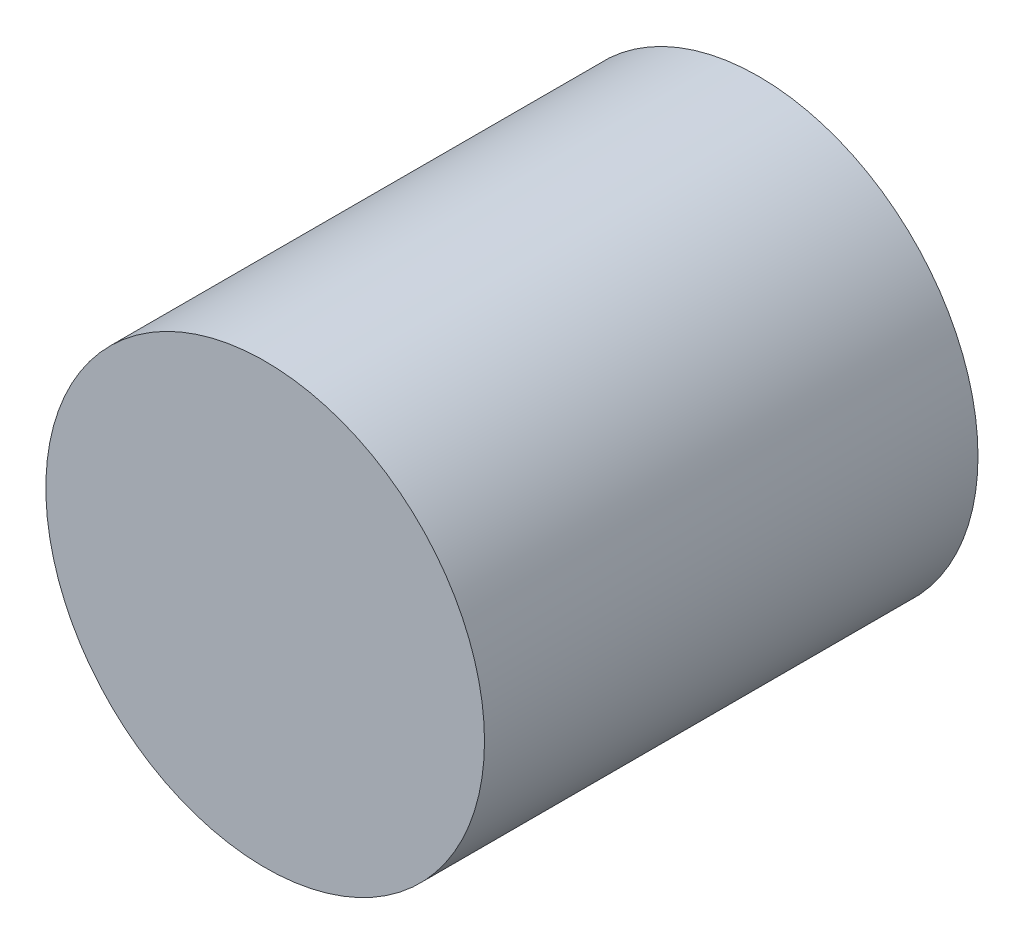
ISO-10303-21;
HEADER;
FILE_DESCRIPTION(('STEP AP214'),'2;1');
FILE_NAME('part.step','',(''),(''),'','','');
FILE_SCHEMA(('AUTOMOTIVE_DESIGN { 1 0 10303 214 1 1 1 1 }'));
ENDSEC;
DATA;
#1=APPLICATION_CONTEXT('core data for automotive mechanical design processes');
#2=APPLICATION_PROTOCOL_DEFINITION('international standard','automotive_design',2000,#1);
#3=PRODUCT_CONTEXT('',#1,'mechanical');
#4=PRODUCT('Part','Part','',(#3));
#5=PRODUCT_RELATED_PRODUCT_CATEGORY('part','',(#4));
#6=PRODUCT_DEFINITION_FORMATION('','',#4);
#7=PRODUCT_DEFINITION_CONTEXT('part definition',#1,'design');
#8=PRODUCT_DEFINITION('design','',#6,#7);
#9=PRODUCT_DEFINITION_SHAPE('','',#8);
#10=(LENGTH_UNIT() NAMED_UNIT(*) SI_UNIT(.MILLI.,.METRE.));
#11=(NAMED_UNIT(*) PLANE_ANGLE_UNIT() SI_UNIT($,.RADIAN.));
#12=(NAMED_UNIT(*) SI_UNIT($,.STERADIAN.) SOLID_ANGLE_UNIT());
#13=UNCERTAINTY_MEASURE_WITH_UNIT(LENGTH_MEASURE(1.E-05),#10,'distance_accuracy_value','');
#14=(GEOMETRIC_REPRESENTATION_CONTEXT(3) GLOBAL_UNCERTAINTY_ASSIGNED_CONTEXT((#13)) GLOBAL_UNIT_ASSIGNED_CONTEXT((#10,
#11,#12)) REPRESENTATION_CONTEXT('',''));
#15=CARTESIAN_POINT('',(0.,0.,0.));
#16=DIRECTION('',(0.,0.,1.));
#17=DIRECTION('',(1.,0.,0.));
#18=AXIS2_PLACEMENT_3D('',#15,#16,#17);
#19=CARTESIAN_POINT('',(425.,-70.,-45.));
#20=DIRECTION('',(0.,0.,-1.));
#21=DIRECTION('',(-0.656521558170549,-0.754307260774623,0.));
#22=AXIS2_PLACEMENT_3D('',#19,#20,#21);
#23=PLANE('',#22);
#24=CARTESIAN_POINT('',(425.,-70.,-45.));
#25=DIRECTION('',(0.,0.,-1.));
#26=DIRECTION('',(-1.,0.,0.));
#27=AXIS2_PLACEMENT_3D('',#24,#25,#26);
#28=CIRCLE('',#27,20.);
#29=CARTESIAN_POINT('',(405.,-70.,-45.));
#30=VERTEX_POINT('',#29);
#31=EDGE_CURVE('E10',#30,#30,#28,.F.);
#32=ORIENTED_EDGE('',*,*,#31,.F.);
#33=EDGE_LOOP('',(#32));
#34=FACE_BOUND('',#33,.T.);
#35=ADVANCED_FACE('F30',(#34),#23,.T.);
#36=CARTESIAN_POINT('',(425.,-70.,0.));
#37=DIRECTION('',(0.,0.,1.));
#38=DIRECTION('',(1.,0.,0.));
#39=AXIS2_PLACEMENT_3D('',#36,#37,#38);
#40=PLANE('',#39);
#41=CARTESIAN_POINT('',(425.,-70.,0.));
#42=DIRECTION('',(0.,0.,1.));
#43=DIRECTION('',(1.,0.,0.));
#44=AXIS2_PLACEMENT_3D('',#41,#42,#43);
#45=CIRCLE('',#44,20.);
#46=CARTESIAN_POINT('',(445.,-70.,0.));
#47=VERTEX_POINT('',#46);
#48=EDGE_CURVE('E36',#47,#47,#45,.T.);
#49=ORIENTED_EDGE('',*,*,#48,.T.);
#50=EDGE_LOOP('',(#49));
#51=FACE_BOUND('',#50,.T.);
#52=ADVANCED_FACE('F42',(#51),#40,.T.);
#53=CARTESIAN_POINT('',(425.,-70.,-101.568542494924));
#54=DIRECTION('',(0.,0.,1.));
#55=DIRECTION('',(1.,0.,0.));
#56=AXIS2_PLACEMENT_3D('',#53,#54,#55);
#57=CYLINDRICAL_SURFACE('',#56,20.);
#58=ORIENTED_EDGE('',*,*,#48,.F.);
#59=EDGE_LOOP('',(#58));
#60=FACE_BOUND('',#59,.T.);
#61=ORIENTED_EDGE('',*,*,#31,.T.);
#62=EDGE_LOOP('',(#61));
#63=FACE_BOUND('',#62,.T.);
#64=ADVANCED_FACE('F44',(#60,#63),#57,.T.);
#65=CLOSED_SHELL('',(#35,#52,#64));
#66=MANIFOLD_SOLID_BREP('B2',#65);
#67=ADVANCED_BREP_SHAPE_REPRESENTATION('',(#18,#66),#14);
#68=SHAPE_DEFINITION_REPRESENTATION(#9,#67);
ENDSEC;
END-ISO-10303-21;
